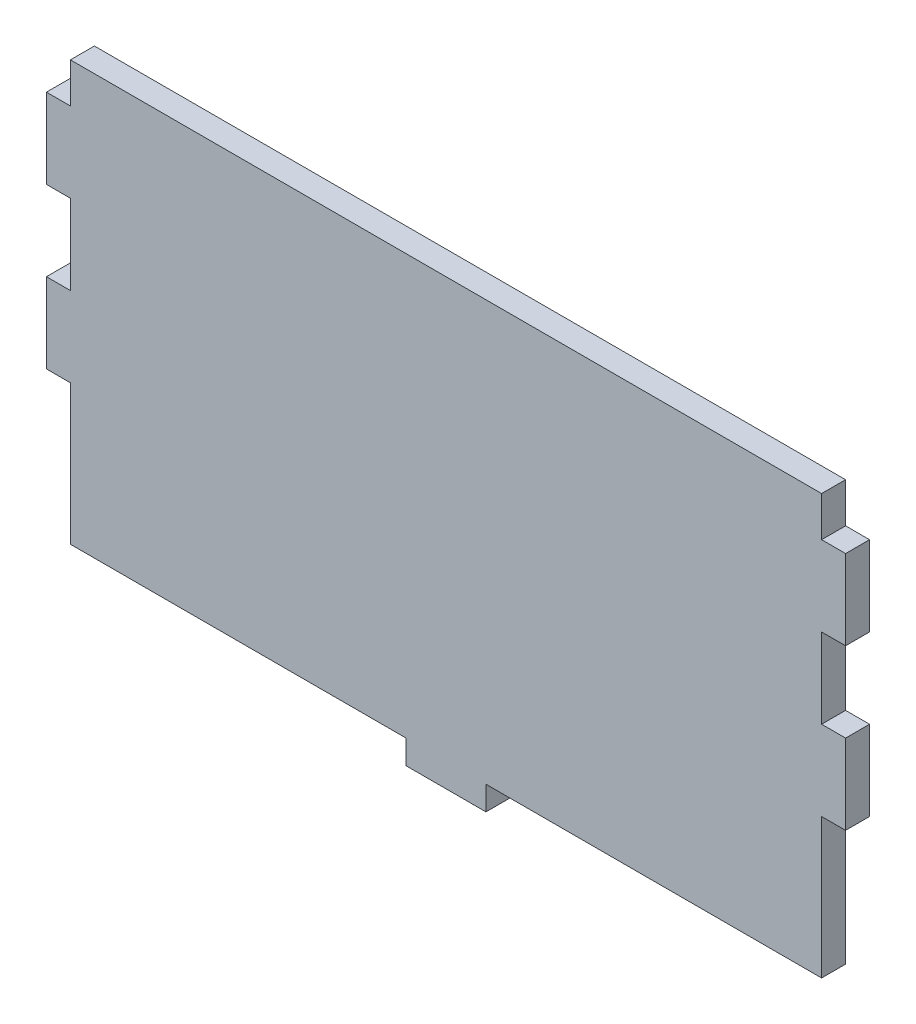
ISO-10303-21;
HEADER;
FILE_DESCRIPTION(('STEP AP214'),'2;1');
FILE_NAME('part.step','',(''),(''),'','','');
FILE_SCHEMA(('AUTOMOTIVE_DESIGN { 1 0 10303 214 1 1 1 1 }'));
ENDSEC;
DATA;
#1=APPLICATION_CONTEXT('core data for automotive mechanical design processes');
#2=APPLICATION_PROTOCOL_DEFINITION('international standard','automotive_design',2000,#1);
#3=PRODUCT_CONTEXT('',#1,'mechanical');
#4=PRODUCT('Part','Part','',(#3));
#5=PRODUCT_RELATED_PRODUCT_CATEGORY('part','',(#4));
#6=PRODUCT_DEFINITION_FORMATION('','',#4);
#7=PRODUCT_DEFINITION_CONTEXT('part definition',#1,'design');
#8=PRODUCT_DEFINITION('design','',#6,#7);
#9=PRODUCT_DEFINITION_SHAPE('','',#8);
#10=(LENGTH_UNIT() NAMED_UNIT(*) SI_UNIT(.MILLI.,.METRE.));
#11=(NAMED_UNIT(*) PLANE_ANGLE_UNIT() SI_UNIT($,.RADIAN.));
#12=(NAMED_UNIT(*) SI_UNIT($,.STERADIAN.) SOLID_ANGLE_UNIT());
#13=UNCERTAINTY_MEASURE_WITH_UNIT(LENGTH_MEASURE(1.E-05),#10,'distance_accuracy_value','');
#14=(GEOMETRIC_REPRESENTATION_CONTEXT(3) GLOBAL_UNCERTAINTY_ASSIGNED_CONTEXT((#13)) GLOBAL_UNIT_ASSIGNED_CONTEXT((#10,
#11,#12)) REPRESENTATION_CONTEXT('',''));
#15=CARTESIAN_POINT('',(0.,0.,0.));
#16=DIRECTION('',(0.,0.,1.));
#17=DIRECTION('',(1.,0.,0.));
#18=AXIS2_PLACEMENT_3D('',#15,#16,#17);
#19=CARTESIAN_POINT('',(-47.,0.,3.));
#20=DIRECTION('',(1.,0.,0.));
#21=DIRECTION('',(0.,1.,0.));
#22=AXIS2_PLACEMENT_3D('',#19,#20,#21);
#23=PLANE('',#22);
#24=DIRECTION('',(0.,0.,-1.));
#25=VECTOR('',#24,1.);
#26=CARTESIAN_POINT('',(-47.,20.2658369438358,3.));
#27=LINE('',#26,#25);
#28=CARTESIAN_POINT('',(-47.,20.2658369438358,3.));
#29=VERTEX_POINT('',#28);
#30=CARTESIAN_POINT('',(-47.,20.2658369438358,0.));
#31=VERTEX_POINT('',#30);
#32=EDGE_CURVE('E498',#29,#31,#27,.T.);
#33=ORIENTED_EDGE('',*,*,#32,.F.);
#34=DIRECTION('',(0.,-1.,0.));
#35=VECTOR('',#34,1.);
#36=CARTESIAN_POINT('',(-47.,0.,3.));
#37=LINE('',#36,#35);
#38=CARTESIAN_POINT('',(-47.,25.2658369438358,3.));
#39=VERTEX_POINT('',#38);
#40=EDGE_CURVE('E467',#39,#29,#37,.T.);
#41=ORIENTED_EDGE('',*,*,#40,.F.);
#42=DIRECTION('',(0.,0.,-1.));
#43=VECTOR('',#42,1.);
#44=CARTESIAN_POINT('',(-47.,25.2658369438358,3.));
#45=LINE('',#44,#43);
#46=CARTESIAN_POINT('',(-47.,25.2658369438358,0.));
#47=VERTEX_POINT('',#46);
#48=EDGE_CURVE('E466',#39,#47,#45,.T.);
#49=ORIENTED_EDGE('',*,*,#48,.T.);
#50=DIRECTION('',(0.,-1.,0.));
#51=VECTOR('',#50,1.);
#52=CARTESIAN_POINT('',(-47.,0.,0.));
#53=LINE('',#52,#51);
#54=EDGE_CURVE('E459',#47,#31,#53,.T.);
#55=ORIENTED_EDGE('',*,*,#54,.T.);
#56=EDGE_LOOP('',(#33,#41,#49,#55));
#57=FACE_BOUND('',#56,.T.);
#58=ADVANCED_FACE('F299',(#57),#23,.F.);
#59=CARTESIAN_POINT('',(-47.,10.2658369438358,3.));
#60=VERTEX_POINT('',#59);
#61=CARTESIAN_POINT('',(-47.,0.265836943835788,3.));
#62=VERTEX_POINT('',#61);
#63=EDGE_CURVE('E556',#60,#62,#37,.T.);
#64=ORIENTED_EDGE('',*,*,#63,.F.);
#65=DIRECTION('',(0.,0.,-1.));
#66=VECTOR('',#65,1.);
#67=CARTESIAN_POINT('',(-47.,10.2658369438358,3.));
#68=LINE('',#67,#66);
#69=CARTESIAN_POINT('',(-47.,10.2658369438358,0.));
#70=VERTEX_POINT('',#69);
#71=EDGE_CURVE('E318',#60,#70,#68,.T.);
#72=ORIENTED_EDGE('',*,*,#71,.T.);
#73=CARTESIAN_POINT('',(-47.,0.265836943835788,0.));
#74=VERTEX_POINT('',#73);
#75=EDGE_CURVE('E454',#70,#74,#53,.T.);
#76=ORIENTED_EDGE('',*,*,#75,.T.);
#77=DIRECTION('',(0.,0.,-1.));
#78=VECTOR('',#77,1.);
#79=CARTESIAN_POINT('',(-47.,0.265836943835788,3.));
#80=LINE('',#79,#78);
#81=EDGE_CURVE('E463',#62,#74,#80,.T.);
#82=ORIENTED_EDGE('',*,*,#81,.F.);
#83=EDGE_LOOP('',(#64,#72,#76,#82));
#84=FACE_BOUND('',#83,.T.);
#85=ADVANCED_FACE('F658',(#84),#23,.F.);
#86=CARTESIAN_POINT('',(-47.,-9.73416305616422,0.));
#87=VERTEX_POINT('',#86);
#88=CARTESIAN_POINT('',(-47.,-27.2341630561642,0.));
#89=VERTEX_POINT('',#88);
#90=EDGE_CURVE('E461',#87,#89,#53,.T.);
#91=ORIENTED_EDGE('',*,*,#90,.T.);
#92=DIRECTION('',(0.,0.,-1.));
#93=VECTOR('',#92,1.);
#94=CARTESIAN_POINT('',(-47.,-27.2341630561642,3.));
#95=LINE('',#94,#93);
#96=CARTESIAN_POINT('',(-47.,-27.2341630561642,3.));
#97=VERTEX_POINT('',#96);
#98=EDGE_CURVE('E486',#97,#89,#95,.T.);
#99=ORIENTED_EDGE('',*,*,#98,.F.);
#100=CARTESIAN_POINT('',(-47.,-9.73416305616422,3.));
#101=VERTEX_POINT('',#100);
#102=EDGE_CURVE('E573',#101,#97,#37,.T.);
#103=ORIENTED_EDGE('',*,*,#102,.F.);
#104=DIRECTION('',(0.,0.,-1.));
#105=VECTOR('',#104,1.);
#106=CARTESIAN_POINT('',(-47.,-9.73416305616422,3.));
#107=LINE('',#106,#105);
#108=EDGE_CURVE('E489',#101,#87,#107,.T.);
#109=ORIENTED_EDGE('',*,*,#108,.T.);
#110=EDGE_LOOP('',(#91,#99,#103,#109));
#111=FACE_BOUND('',#110,.T.);
#112=ADVANCED_FACE('F660',(#111),#23,.F.);
#113=CARTESIAN_POINT('',(0.,-27.2341630561642,3.));
#114=DIRECTION('',(0.,1.,0.));
#115=DIRECTION('',(0.,0.,1.));
#116=AXIS2_PLACEMENT_3D('',#113,#114,#115);
#117=PLANE('',#116);
#118=DIRECTION('',(1.,0.,0.));
#119=VECTOR('',#118,1.);
#120=CARTESIAN_POINT('',(0.,-27.2341630561642,0.));
#121=LINE('',#120,#119);
#122=CARTESIAN_POINT('',(5.00000000000001,-27.2341630561642,0.));
#123=VERTEX_POINT('',#122);
#124=CARTESIAN_POINT('',(47.,-27.2341630561642,0.));
#125=VERTEX_POINT('',#124);
#126=EDGE_CURVE('E442',#123,#125,#121,.T.);
#127=ORIENTED_EDGE('',*,*,#126,.T.);
#128=DIRECTION('',(0.,0.,-1.));
#129=VECTOR('',#128,1.);
#130=CARTESIAN_POINT('',(47.,-27.2341630561642,3.));
#131=LINE('',#130,#129);
#132=CARTESIAN_POINT('',(47.,-27.2341630561642,3.));
#133=VERTEX_POINT('',#132);
#134=EDGE_CURVE('E440',#133,#125,#131,.T.);
#135=ORIENTED_EDGE('',*,*,#134,.F.);
#136=DIRECTION('',(1.,0.,0.));
#137=VECTOR('',#136,1.);
#138=CARTESIAN_POINT('',(0.,-27.2341630561642,3.));
#139=LINE('',#138,#137);
#140=CARTESIAN_POINT('',(5.00000000000001,-27.2341630561642,3.));
#141=VERTEX_POINT('',#140);
#142=EDGE_CURVE('E559',#141,#133,#139,.T.);
#143=ORIENTED_EDGE('',*,*,#142,.F.);
#144=DIRECTION('',(0.,0.,-1.));
#145=VECTOR('',#144,1.);
#146=CARTESIAN_POINT('',(5.00000000000001,-27.2341630561642,3.));
#147=LINE('',#146,#145);
#148=EDGE_CURVE('E474',#141,#123,#147,.T.);
#149=ORIENTED_EDGE('',*,*,#148,.T.);
#150=EDGE_LOOP('',(#127,#135,#143,#149));
#151=FACE_BOUND('',#150,.T.);
#152=ADVANCED_FACE('F668',(#151),#117,.F.);
#153=CARTESIAN_POINT('',(-4.99999999999999,-27.2341630561642,0.));
#154=VERTEX_POINT('',#153);
#155=EDGE_CURVE('E447',#89,#154,#121,.T.);
#156=ORIENTED_EDGE('',*,*,#155,.T.);
#157=DIRECTION('',(0.,0.,-1.));
#158=VECTOR('',#157,1.);
#159=CARTESIAN_POINT('',(-4.99999999999999,-27.2341630561642,3.));
#160=LINE('',#159,#158);
#161=CARTESIAN_POINT('',(-4.99999999999999,-27.2341630561642,3.));
#162=VERTEX_POINT('',#161);
#163=EDGE_CURVE('E483',#162,#154,#160,.T.);
#164=ORIENTED_EDGE('',*,*,#163,.F.);
#165=EDGE_CURVE('E565',#97,#162,#139,.T.);
#166=ORIENTED_EDGE('',*,*,#165,.F.);
#167=ORIENTED_EDGE('',*,*,#98,.T.);
#168=EDGE_LOOP('',(#156,#164,#166,#167));
#169=FACE_BOUND('',#168,.T.);
#170=ADVANCED_FACE('F650',(#169),#117,.F.);
#171=CARTESIAN_POINT('',(47.,0.,3.));
#172=DIRECTION('',(1.,0.,0.));
#173=DIRECTION('',(0.,1.,0.));
#174=AXIS2_PLACEMENT_3D('',#171,#172,#173);
#175=PLANE('',#174);
#176=DIRECTION('',(0.,0.,-1.));
#177=VECTOR('',#176,1.);
#178=CARTESIAN_POINT('',(47.,-9.73416305616422,3.));
#179=LINE('',#178,#177);
#180=CARTESIAN_POINT('',(47.,-9.73416305616421,3.));
#181=VERTEX_POINT('',#180);
#182=CARTESIAN_POINT('',(47.,-9.73416305616421,0.));
#183=VERTEX_POINT('',#182);
#184=EDGE_CURVE('E303',#181,#183,#179,.T.);
#185=ORIENTED_EDGE('',*,*,#184,.F.);
#186=DIRECTION('',(0.,-1.,0.));
#187=VECTOR('',#186,1.);
#188=CARTESIAN_POINT('',(47.,0.,3.));
#189=LINE('',#188,#187);
#190=EDGE_CURVE('E555',#181,#133,#189,.T.);
#191=ORIENTED_EDGE('',*,*,#190,.T.);
#192=ORIENTED_EDGE('',*,*,#134,.T.);
#193=DIRECTION('',(0.,-1.,0.));
#194=VECTOR('',#193,1.);
#195=CARTESIAN_POINT('',(47.,0.,0.));
#196=LINE('',#195,#194);
#197=EDGE_CURVE('E432',#183,#125,#196,.T.);
#198=ORIENTED_EDGE('',*,*,#197,.F.);
#199=EDGE_LOOP('',(#185,#191,#192,#198));
#200=FACE_BOUND('',#199,.T.);
#201=ADVANCED_FACE('F437',(#200),#175,.T.);
#202=DIRECTION('',(0.,0.,-1.));
#203=VECTOR('',#202,1.);
#204=CARTESIAN_POINT('',(47.,10.2658369438358,3.));
#205=LINE('',#204,#203);
#206=CARTESIAN_POINT('',(47.,10.2658369438358,3.));
#207=VERTEX_POINT('',#206);
#208=CARTESIAN_POINT('',(47.,10.2658369438358,0.));
#209=VERTEX_POINT('',#208);
#210=EDGE_CURVE('E309',#207,#209,#205,.T.);
#211=ORIENTED_EDGE('',*,*,#210,.F.);
#212=CARTESIAN_POINT('',(47.,0.265836943835789,3.));
#213=VERTEX_POINT('',#212);
#214=EDGE_CURVE('E535',#207,#213,#189,.T.);
#215=ORIENTED_EDGE('',*,*,#214,.T.);
#216=DIRECTION('',(0.,0.,-1.));
#217=VECTOR('',#216,1.);
#218=CARTESIAN_POINT('',(47.,0.265836943835788,3.));
#219=LINE('',#218,#217);
#220=CARTESIAN_POINT('',(47.,0.265836943835789,0.));
#221=VERTEX_POINT('',#220);
#222=EDGE_CURVE('E396',#213,#221,#219,.T.);
#223=ORIENTED_EDGE('',*,*,#222,.T.);
#224=EDGE_CURVE('E389',#209,#221,#196,.T.);
#225=ORIENTED_EDGE('',*,*,#224,.F.);
#226=EDGE_LOOP('',(#211,#215,#223,#225));
#227=FACE_BOUND('',#226,.T.);
#228=ADVANCED_FACE('F642',(#227),#175,.T.);
#229=CARTESIAN_POINT('',(47.,25.2658369438358,3.));
#230=VERTEX_POINT('',#229);
#231=CARTESIAN_POINT('',(47.,20.2658369438358,3.));
#232=VERTEX_POINT('',#231);
#233=EDGE_CURVE('E547',#230,#232,#189,.T.);
#234=ORIENTED_EDGE('',*,*,#233,.T.);
#235=DIRECTION('',(0.,0.,-1.));
#236=VECTOR('',#235,1.);
#237=CARTESIAN_POINT('',(47.,20.2658369438358,3.));
#238=LINE('',#237,#236);
#239=CARTESIAN_POINT('',(47.,20.2658369438358,0.));
#240=VERTEX_POINT('',#239);
#241=EDGE_CURVE('E12',#232,#240,#238,.T.);
#242=ORIENTED_EDGE('',*,*,#241,.T.);
#243=CARTESIAN_POINT('',(47.,25.2658369438358,0.));
#244=VERTEX_POINT('',#243);
#245=EDGE_CURVE('E444',#244,#240,#196,.T.);
#246=ORIENTED_EDGE('',*,*,#245,.F.);
#247=DIRECTION('',(0.,0.,-1.));
#248=VECTOR('',#247,1.);
#249=CARTESIAN_POINT('',(47.,25.2658369438358,3.));
#250=LINE('',#249,#248);
#251=EDGE_CURVE('E470',#230,#244,#250,.T.);
#252=ORIENTED_EDGE('',*,*,#251,.F.);
#253=EDGE_LOOP('',(#234,#242,#246,#252));
#254=FACE_BOUND('',#253,.T.);
#255=ADVANCED_FACE('F552',(#254),#175,.T.);
#256=CARTESIAN_POINT('',(0.,25.2658369438358,3.));
#257=DIRECTION('',(0.,1.,0.));
#258=DIRECTION('',(0.,0.,1.));
#259=AXIS2_PLACEMENT_3D('',#256,#257,#258);
#260=PLANE('',#259);
#261=DIRECTION('',(1.,0.,0.));
#262=VECTOR('',#261,1.);
#263=CARTESIAN_POINT('',(0.,25.2658369438358,0.));
#264=LINE('',#263,#262);
#265=EDGE_CURVE('E450',#47,#244,#264,.T.);
#266=ORIENTED_EDGE('',*,*,#265,.F.);
#267=ORIENTED_EDGE('',*,*,#48,.F.);
#268=DIRECTION('',(1.,0.,0.));
#269=VECTOR('',#268,1.);
#270=CARTESIAN_POINT('',(0.,25.2658369438358,3.));
#271=LINE('',#270,#269);
#272=EDGE_CURVE('E553',#39,#230,#271,.T.);
#273=ORIENTED_EDGE('',*,*,#272,.T.);
#274=ORIENTED_EDGE('',*,*,#251,.T.);
#275=EDGE_LOOP('',(#266,#267,#273,#274));
#276=FACE_BOUND('',#275,.T.);
#277=ADVANCED_FACE('F649',(#276),#260,.T.);
#278=CARTESIAN_POINT('',(0.,0.265836943835802,3.));
#279=DIRECTION('',(0.,-1.,0.));
#280=DIRECTION('',(1.,0.,0.));
#281=AXIS2_PLACEMENT_3D('',#278,#279,#280);
#282=PLANE('',#281);
#283=DIRECTION('',(-1.,0.,0.));
#284=VECTOR('',#283,1.);
#285=CARTESIAN_POINT('',(0.,0.265836943835802,0.));
#286=LINE('',#285,#284);
#287=CARTESIAN_POINT('',(-50.,0.265836943835787,0.));
#288=VERTEX_POINT('',#287);
#289=EDGE_CURVE('E520',#74,#288,#286,.T.);
#290=ORIENTED_EDGE('',*,*,#289,.T.);
#291=DIRECTION('',(0.,0.,-1.));
#292=VECTOR('',#291,1.);
#293=CARTESIAN_POINT('',(-50.,0.265836943835787,3.));
#294=LINE('',#293,#292);
#295=CARTESIAN_POINT('',(-50.,0.265836943835787,3.));
#296=VERTEX_POINT('',#295);
#297=EDGE_CURVE('E495',#296,#288,#294,.T.);
#298=ORIENTED_EDGE('',*,*,#297,.F.);
#299=DIRECTION('',(-1.,0.,0.));
#300=VECTOR('',#299,1.);
#301=CARTESIAN_POINT('',(0.,0.265836943835802,3.));
#302=LINE('',#301,#300);
#303=EDGE_CURVE('E763',#62,#296,#302,.T.);
#304=ORIENTED_EDGE('',*,*,#303,.F.);
#305=ORIENTED_EDGE('',*,*,#81,.T.);
#306=EDGE_LOOP('',(#290,#298,#304,#305));
#307=FACE_BOUND('',#306,.T.);
#308=ADVANCED_FACE('F665',(#307),#282,.F.);
#309=CARTESIAN_POINT('',(-50.,-1.38777878078145E-13,3.));
#310=DIRECTION('',(1.,0.,0.));
#311=DIRECTION('',(0.,1.,0.));
#312=AXIS2_PLACEMENT_3D('',#309,#310,#311);
#313=PLANE('',#312);
#314=DIRECTION('',(0.,-1.,0.));
#315=VECTOR('',#314,1.);
#316=CARTESIAN_POINT('',(-50.,-1.38777878078145E-13,0.));
#317=LINE('',#316,#315);
#318=CARTESIAN_POINT('',(-50.,-9.73416305616421,0.));
#319=VERTEX_POINT('',#318);
#320=EDGE_CURVE('E748',#288,#319,#317,.T.);
#321=ORIENTED_EDGE('',*,*,#320,.T.);
#322=DIRECTION('',(0.,0.,-1.));
#323=VECTOR('',#322,1.);
#324=CARTESIAN_POINT('',(-50.,-9.73416305616421,3.));
#325=LINE('',#324,#323);
#326=CARTESIAN_POINT('',(-50.,-9.73416305616421,3.));
#327=VERTEX_POINT('',#326);
#328=EDGE_CURVE('E492',#327,#319,#325,.T.);
#329=ORIENTED_EDGE('',*,*,#328,.F.);
#330=DIRECTION('',(0.,-1.,0.));
#331=VECTOR('',#330,1.);
#332=CARTESIAN_POINT('',(-50.,-1.38777878078145E-13,3.));
#333=LINE('',#332,#331);
#334=EDGE_CURVE('E585',#296,#327,#333,.T.);
#335=ORIENTED_EDGE('',*,*,#334,.F.);
#336=ORIENTED_EDGE('',*,*,#297,.T.);
#337=EDGE_LOOP('',(#321,#329,#335,#336));
#338=FACE_BOUND('',#337,.T.);
#339=ADVANCED_FACE('F683',(#338),#313,.F.);
#340=CARTESIAN_POINT('',(0.,-9.73416305616424,3.));
#341=DIRECTION('',(0.,-1.,0.));
#342=DIRECTION('',(1.,0.,0.));
#343=AXIS2_PLACEMENT_3D('',#340,#341,#342);
#344=PLANE('',#343);
#345=DIRECTION('',(-1.,0.,0.));
#346=VECTOR('',#345,1.);
#347=CARTESIAN_POINT('',(0.,-9.73416305616424,0.));
#348=LINE('',#347,#346);
#349=EDGE_CURVE('E745',#87,#319,#348,.T.);
#350=ORIENTED_EDGE('',*,*,#349,.F.);
#351=ORIENTED_EDGE('',*,*,#108,.F.);
#352=DIRECTION('',(-1.,0.,0.));
#353=VECTOR('',#352,1.);
#354=CARTESIAN_POINT('',(0.,-9.73416305616424,3.));
#355=LINE('',#354,#353);
#356=EDGE_CURVE('E579',#101,#327,#355,.T.);
#357=ORIENTED_EDGE('',*,*,#356,.T.);
#358=ORIENTED_EDGE('',*,*,#328,.T.);
#359=EDGE_LOOP('',(#350,#351,#357,#358));
#360=FACE_BOUND('',#359,.T.);
#361=ADVANCED_FACE('F671',(#360),#344,.T.);
#362=CARTESIAN_POINT('',(-47.,20.2658369438358,3.));
#363=DIRECTION('',(0.,-1.,0.));
#364=DIRECTION('',(0.,0.,-1.));
#365=AXIS2_PLACEMENT_3D('',#362,#363,#364);
#366=PLANE('',#365);
#367=DIRECTION('',(-1.,0.,0.));
#368=VECTOR('',#367,1.);
#369=CARTESIAN_POINT('',(-47.,20.2658369438358,0.));
#370=LINE('',#369,#368);
#371=CARTESIAN_POINT('',(-50.,20.2658369438358,0.));
#372=VERTEX_POINT('',#371);
#373=EDGE_CURVE('E502',#31,#372,#370,.T.);
#374=ORIENTED_EDGE('',*,*,#373,.T.);
#375=DIRECTION('',(0.,0.,-1.));
#376=VECTOR('',#375,1.);
#377=CARTESIAN_POINT('',(-50.,20.2658369438358,3.));
#378=LINE('',#377,#376);
#379=CARTESIAN_POINT('',(-50.,20.2658369438358,3.));
#380=VERTEX_POINT('',#379);
#381=EDGE_CURVE('E518',#380,#372,#378,.T.);
#382=ORIENTED_EDGE('',*,*,#381,.F.);
#383=DIRECTION('',(-1.,0.,0.));
#384=VECTOR('',#383,1.);
#385=CARTESIAN_POINT('',(-47.,20.2658369438358,3.));
#386=LINE('',#385,#384);
#387=EDGE_CURVE('E505',#29,#380,#386,.T.);
#388=ORIENTED_EDGE('',*,*,#387,.F.);
#389=ORIENTED_EDGE('',*,*,#32,.T.);
#390=EDGE_LOOP('',(#374,#382,#388,#389));
#391=FACE_BOUND('',#390,.T.);
#392=ADVANCED_FACE('F670',(#391),#366,.F.);
#393=CARTESIAN_POINT('',(-50.,10.2658369438358,3.));
#394=DIRECTION('',(-1.,0.,0.));
#395=DIRECTION('',(0.,-1.,0.));
#396=AXIS2_PLACEMENT_3D('',#393,#394,#395);
#397=PLANE('',#396);
#398=DIRECTION('',(0.,1.,0.));
#399=VECTOR('',#398,1.);
#400=CARTESIAN_POINT('',(-50.,10.2658369438358,0.));
#401=LINE('',#400,#399);
#402=CARTESIAN_POINT('',(-50.,10.2658369438358,0.));
#403=VERTEX_POINT('',#402);
#404=EDGE_CURVE('E510',#403,#372,#401,.T.);
#405=ORIENTED_EDGE('',*,*,#404,.F.);
#406=DIRECTION('',(0.,0.,-1.));
#407=VECTOR('',#406,1.);
#408=CARTESIAN_POINT('',(-50.,10.2658369438358,3.));
#409=LINE('',#408,#407);
#410=CARTESIAN_POINT('',(-50.,10.2658369438358,3.));
#411=VERTEX_POINT('',#410);
#412=EDGE_CURVE('E507',#411,#403,#409,.T.);
#413=ORIENTED_EDGE('',*,*,#412,.F.);
#414=DIRECTION('',(0.,1.,0.));
#415=VECTOR('',#414,1.);
#416=CARTESIAN_POINT('',(-50.,10.2658369438358,3.));
#417=LINE('',#416,#415);
#418=EDGE_CURVE('E501',#411,#380,#417,.T.);
#419=ORIENTED_EDGE('',*,*,#418,.T.);
#420=ORIENTED_EDGE('',*,*,#381,.T.);
#421=EDGE_LOOP('',(#405,#413,#419,#420));
#422=FACE_BOUND('',#421,.T.);
#423=ADVANCED_FACE('F679',(#422),#397,.T.);
#424=CARTESIAN_POINT('',(-47.,10.2658369438358,3.));
#425=DIRECTION('',(0.,-1.,0.));
#426=DIRECTION('',(0.,0.,-1.));
#427=AXIS2_PLACEMENT_3D('',#424,#425,#426);
#428=PLANE('',#427);
#429=DIRECTION('',(-1.,0.,0.));
#430=VECTOR('',#429,1.);
#431=CARTESIAN_POINT('',(-47.,10.2658369438358,0.));
#432=LINE('',#431,#430);
#433=EDGE_CURVE('E419',#70,#403,#432,.T.);
#434=ORIENTED_EDGE('',*,*,#433,.F.);
#435=ORIENTED_EDGE('',*,*,#71,.F.);
#436=DIRECTION('',(-1.,0.,0.));
#437=VECTOR('',#436,1.);
#438=CARTESIAN_POINT('',(-47.,10.2658369438358,3.));
#439=LINE('',#438,#437);
#440=EDGE_CURVE('E499',#60,#411,#439,.T.);
#441=ORIENTED_EDGE('',*,*,#440,.T.);
#442=ORIENTED_EDGE('',*,*,#412,.T.);
#443=EDGE_LOOP('',(#434,#435,#441,#442));
#444=FACE_BOUND('',#443,.T.);
#445=ADVANCED_FACE('F677',(#444),#428,.T.);
#446=CARTESIAN_POINT('',(0.,-30.2341630561642,3.));
#447=DIRECTION('',(0.,1.,0.));
#448=DIRECTION('',(0.,0.,1.));
#449=AXIS2_PLACEMENT_3D('',#446,#447,#448);
#450=PLANE('',#449);
#451=DIRECTION('',(1.,0.,0.));
#452=VECTOR('',#451,1.);
#453=CARTESIAN_POINT('',(0.,-30.2341630561642,0.));
#454=LINE('',#453,#452);
#455=CARTESIAN_POINT('',(-5.,-30.2341630561642,0.));
#456=VERTEX_POINT('',#455);
#457=CARTESIAN_POINT('',(5.,-30.2341630561642,0.));
#458=VERTEX_POINT('',#457);
#459=EDGE_CURVE('E734',#456,#458,#454,.T.);
#460=ORIENTED_EDGE('',*,*,#459,.T.);
#461=DIRECTION('',(0.,0.,-1.));
#462=VECTOR('',#461,1.);
#463=CARTESIAN_POINT('',(5.,-30.2341630561642,3.));
#464=LINE('',#463,#462);
#465=CARTESIAN_POINT('',(5.,-30.2341630561642,3.));
#466=VERTEX_POINT('',#465);
#467=EDGE_CURVE('E477',#466,#458,#464,.T.);
#468=ORIENTED_EDGE('',*,*,#467,.F.);
#469=DIRECTION('',(1.,0.,0.));
#470=VECTOR('',#469,1.);
#471=CARTESIAN_POINT('',(0.,-30.2341630561642,3.));
#472=LINE('',#471,#470);
#473=CARTESIAN_POINT('',(-5.,-30.2341630561642,3.));
#474=VERTEX_POINT('',#473);
#475=EDGE_CURVE('E568',#474,#466,#472,.T.);
#476=ORIENTED_EDGE('',*,*,#475,.F.);
#477=DIRECTION('',(0.,0.,-1.));
#478=VECTOR('',#477,1.);
#479=CARTESIAN_POINT('',(-5.,-30.2341630561642,3.));
#480=LINE('',#479,#478);
#481=EDGE_CURVE('E480',#474,#456,#480,.T.);
#482=ORIENTED_EDGE('',*,*,#481,.T.);
#483=EDGE_LOOP('',(#460,#468,#476,#482));
#484=FACE_BOUND('',#483,.T.);
#485=ADVANCED_FACE('F676',(#484),#450,.F.);
#486=CARTESIAN_POINT('',(5.00000000000006,0.,3.));
#487=DIRECTION('',(1.,0.,0.));
#488=DIRECTION('',(0.,1.,0.));
#489=AXIS2_PLACEMENT_3D('',#486,#487,#488);
#490=PLANE('',#489);
#491=DIRECTION('',(0.,-1.,0.));
#492=VECTOR('',#491,1.);
#493=CARTESIAN_POINT('',(5.00000000000006,0.,0.));
#494=LINE('',#493,#492);
#495=EDGE_CURVE('E445',#123,#458,#494,.T.);
#496=ORIENTED_EDGE('',*,*,#495,.F.);
#497=ORIENTED_EDGE('',*,*,#148,.F.);
#498=DIRECTION('',(0.,-1.,0.));
#499=VECTOR('',#498,1.);
#500=CARTESIAN_POINT('',(5.00000000000006,0.,3.));
#501=LINE('',#500,#499);
#502=EDGE_CURVE('E563',#141,#466,#501,.T.);
#503=ORIENTED_EDGE('',*,*,#502,.T.);
#504=ORIENTED_EDGE('',*,*,#467,.T.);
#505=EDGE_LOOP('',(#496,#497,#503,#504));
#506=FACE_BOUND('',#505,.T.);
#507=ADVANCED_FACE('F724',(#506),#490,.T.);
#508=CARTESIAN_POINT('',(-4.99999999999999,0.,3.));
#509=DIRECTION('',(1.,0.,0.));
#510=DIRECTION('',(0.,1.,0.));
#511=AXIS2_PLACEMENT_3D('',#508,#509,#510);
#512=PLANE('',#511);
#513=DIRECTION('',(0.,-1.,0.));
#514=VECTOR('',#513,1.);
#515=CARTESIAN_POINT('',(-4.99999999999999,0.,0.));
#516=LINE('',#515,#514);
#517=EDGE_CURVE('E739',#154,#456,#516,.T.);
#518=ORIENTED_EDGE('',*,*,#517,.T.);
#519=ORIENTED_EDGE('',*,*,#481,.F.);
#520=DIRECTION('',(0.,-1.,0.));
#521=VECTOR('',#520,1.);
#522=CARTESIAN_POINT('',(-4.99999999999999,0.,3.));
#523=LINE('',#522,#521);
#524=EDGE_CURVE('E572',#162,#474,#523,.T.);
#525=ORIENTED_EDGE('',*,*,#524,.F.);
#526=ORIENTED_EDGE('',*,*,#163,.T.);
#527=EDGE_LOOP('',(#518,#519,#525,#526));
#528=FACE_BOUND('',#527,.T.);
#529=ADVANCED_FACE('F693',(#528),#512,.F.);
#530=CARTESIAN_POINT('',(0.,0.,0.));
#531=DIRECTION('',(0.,0.,1.));
#532=DIRECTION('',(1.,0.,0.));
#533=AXIS2_PLACEMENT_3D('',#530,#531,#532);
#534=PLANE('',#533);
#535=ORIENTED_EDGE('',*,*,#517,.F.);
#536=ORIENTED_EDGE('',*,*,#155,.F.);
#537=ORIENTED_EDGE('',*,*,#90,.F.);
#538=ORIENTED_EDGE('',*,*,#349,.T.);
#539=ORIENTED_EDGE('',*,*,#320,.F.);
#540=ORIENTED_EDGE('',*,*,#289,.F.);
#541=ORIENTED_EDGE('',*,*,#75,.F.);
#542=ORIENTED_EDGE('',*,*,#433,.T.);
#543=ORIENTED_EDGE('',*,*,#404,.T.);
#544=ORIENTED_EDGE('',*,*,#373,.F.);
#545=ORIENTED_EDGE('',*,*,#54,.F.);
#546=ORIENTED_EDGE('',*,*,#265,.T.);
#547=ORIENTED_EDGE('',*,*,#245,.T.);
#548=DIRECTION('',(1.,0.,0.));
#549=VECTOR('',#548,1.);
#550=CARTESIAN_POINT('',(47.,20.2658369438358,0.));
#551=LINE('',#550,#549);
#552=CARTESIAN_POINT('',(50.,20.2658369438358,0.));
#553=VERTEX_POINT('',#552);
#554=EDGE_CURVE('E398',#240,#553,#551,.T.);
#555=ORIENTED_EDGE('',*,*,#554,.T.);
#556=DIRECTION('',(0.,1.,0.));
#557=VECTOR('',#556,1.);
#558=CARTESIAN_POINT('',(50.,10.2658369438358,0.));
#559=LINE('',#558,#557);
#560=CARTESIAN_POINT('',(50.,10.2658369438358,0.));
#561=VERTEX_POINT('',#560);
#562=EDGE_CURVE('E400',#561,#553,#559,.T.);
#563=ORIENTED_EDGE('',*,*,#562,.F.);
#564=DIRECTION('',(1.,0.,0.));
#565=VECTOR('',#564,1.);
#566=CARTESIAN_POINT('',(47.,10.2658369438358,0.));
#567=LINE('',#566,#565);
#568=EDGE_CURVE('E406',#209,#561,#567,.T.);
#569=ORIENTED_EDGE('',*,*,#568,.F.);
#570=ORIENTED_EDGE('',*,*,#224,.T.);
#571=DIRECTION('',(1.,0.,0.));
#572=VECTOR('',#571,1.);
#573=CARTESIAN_POINT('',(47.,0.265836943835788,0.));
#574=LINE('',#573,#572);
#575=CARTESIAN_POINT('',(50.,0.265836943835787,0.));
#576=VERTEX_POINT('',#575);
#577=EDGE_CURVE('E372',#221,#576,#574,.T.);
#578=ORIENTED_EDGE('',*,*,#577,.T.);
#579=DIRECTION('',(0.,-1.,0.));
#580=VECTOR('',#579,1.);
#581=CARTESIAN_POINT('',(50.,0.265836943835787,0.));
#582=LINE('',#581,#580);
#583=CARTESIAN_POINT('',(50.,-9.73416305616421,0.));
#584=VERTEX_POINT('',#583);
#585=EDGE_CURVE('E379',#576,#584,#582,.T.);
#586=ORIENTED_EDGE('',*,*,#585,.T.);
#587=DIRECTION('',(1.,0.,0.));
#588=VECTOR('',#587,1.);
#589=CARTESIAN_POINT('',(47.,-9.73416305616422,0.));
#590=LINE('',#589,#588);
#591=EDGE_CURVE('E383',#183,#584,#590,.T.);
#592=ORIENTED_EDGE('',*,*,#591,.F.);
#593=ORIENTED_EDGE('',*,*,#197,.T.);
#594=ORIENTED_EDGE('',*,*,#126,.F.);
#595=ORIENTED_EDGE('',*,*,#495,.T.);
#596=ORIENTED_EDGE('',*,*,#459,.F.);
#597=EDGE_LOOP('',(#535,#536,#537,#538,#539,#540,#541,#542,#543,#544,#545,#546,#547,#555,#563,
#569,#570,#578,#586,#592,#593,#594,#595,#596));
#598=FACE_BOUND('',#597,.T.);
#599=ADVANCED_FACE('F386',(#598),#534,.F.);
#600=CARTESIAN_POINT('',(0.,0.,3.));
#601=DIRECTION('',(0.,0.,1.));
#602=DIRECTION('',(1.,0.,0.));
#603=AXIS2_PLACEMENT_3D('',#600,#601,#602);
#604=PLANE('',#603);
#605=ORIENTED_EDGE('',*,*,#502,.F.);
#606=ORIENTED_EDGE('',*,*,#142,.T.);
#607=ORIENTED_EDGE('',*,*,#190,.F.);
#608=DIRECTION('',(1.,0.,0.));
#609=VECTOR('',#608,1.);
#610=CARTESIAN_POINT('',(47.,-9.73416305616422,3.));
#611=LINE('',#610,#609);
#612=CARTESIAN_POINT('',(50.,-9.73416305616421,3.));
#613=VERTEX_POINT('',#612);
#614=EDGE_CURVE('E390',#181,#613,#611,.T.);
#615=ORIENTED_EDGE('',*,*,#614,.T.);
#616=DIRECTION('',(0.,-1.,0.));
#617=VECTOR('',#616,1.);
#618=CARTESIAN_POINT('',(50.,0.265836943835787,3.));
#619=LINE('',#618,#617);
#620=CARTESIAN_POINT('',(50.,0.265836943835787,3.));
#621=VERTEX_POINT('',#620);
#622=EDGE_CURVE('E392',#621,#613,#619,.T.);
#623=ORIENTED_EDGE('',*,*,#622,.F.);
#624=DIRECTION('',(1.,0.,0.));
#625=VECTOR('',#624,1.);
#626=CARTESIAN_POINT('',(47.,0.265836943835788,3.));
#627=LINE('',#626,#625);
#628=EDGE_CURVE('E375',#213,#621,#627,.T.);
#629=ORIENTED_EDGE('',*,*,#628,.F.);
#630=ORIENTED_EDGE('',*,*,#214,.F.);
#631=DIRECTION('',(1.,0.,0.));
#632=VECTOR('',#631,1.);
#633=CARTESIAN_POINT('',(47.,10.2658369438358,3.));
#634=LINE('',#633,#632);
#635=CARTESIAN_POINT('',(50.,10.2658369438358,3.));
#636=VERTEX_POINT('',#635);
#637=EDGE_CURVE('E409',#207,#636,#634,.T.);
#638=ORIENTED_EDGE('',*,*,#637,.T.);
#639=DIRECTION('',(0.,1.,0.));
#640=VECTOR('',#639,1.);
#641=CARTESIAN_POINT('',(50.,10.2658369438358,3.));
#642=LINE('',#641,#640);
#643=CARTESIAN_POINT('',(50.,20.2658369438358,3.));
#644=VERTEX_POINT('',#643);
#645=EDGE_CURVE('E523',#636,#644,#642,.T.);
#646=ORIENTED_EDGE('',*,*,#645,.T.);
#647=DIRECTION('',(1.,0.,0.));
#648=VECTOR('',#647,1.);
#649=CARTESIAN_POINT('',(47.,20.2658369438358,3.));
#650=LINE('',#649,#648);
#651=EDGE_CURVE('E413',#232,#644,#650,.T.);
#652=ORIENTED_EDGE('',*,*,#651,.F.);
#653=ORIENTED_EDGE('',*,*,#233,.F.);
#654=ORIENTED_EDGE('',*,*,#272,.F.);
#655=ORIENTED_EDGE('',*,*,#40,.T.);
#656=ORIENTED_EDGE('',*,*,#387,.T.);
#657=ORIENTED_EDGE('',*,*,#418,.F.);
#658=ORIENTED_EDGE('',*,*,#440,.F.);
#659=ORIENTED_EDGE('',*,*,#63,.T.);
#660=ORIENTED_EDGE('',*,*,#303,.T.);
#661=ORIENTED_EDGE('',*,*,#334,.T.);
#662=ORIENTED_EDGE('',*,*,#356,.F.);
#663=ORIENTED_EDGE('',*,*,#102,.T.);
#664=ORIENTED_EDGE('',*,*,#165,.T.);
#665=ORIENTED_EDGE('',*,*,#524,.T.);
#666=ORIENTED_EDGE('',*,*,#475,.T.);
#667=EDGE_LOOP('',(#605,#606,#607,#615,#623,#629,#630,#638,#646,#652,#653,#654,#655,#656,#657,
#658,#659,#660,#661,#662,#663,#664,#665,#666));
#668=FACE_BOUND('',#667,.T.);
#669=ADVANCED_FACE('F532',(#668),#604,.T.);
#670=CARTESIAN_POINT('',(47.,-9.73416305616422,3.));
#671=DIRECTION('',(0.,1.,0.));
#672=DIRECTION('',(-1.,0.,0.));
#673=AXIS2_PLACEMENT_3D('',#670,#671,#672);
#674=PLANE('',#673);
#675=ORIENTED_EDGE('',*,*,#591,.T.);
#676=DIRECTION('',(0.,0.,-1.));
#677=VECTOR('',#676,1.);
#678=CARTESIAN_POINT('',(50.,-9.73416305616421,3.));
#679=LINE('',#678,#677);
#680=EDGE_CURVE('E361',#613,#584,#679,.T.);
#681=ORIENTED_EDGE('',*,*,#680,.F.);
#682=ORIENTED_EDGE('',*,*,#614,.F.);
#683=ORIENTED_EDGE('',*,*,#184,.T.);
#684=EDGE_LOOP('',(#675,#681,#682,#683));
#685=FACE_BOUND('',#684,.T.);
#686=ADVANCED_FACE('F301',(#685),#674,.F.);
#687=CARTESIAN_POINT('',(50.,0.265836943835787,3.));
#688=DIRECTION('',(1.,0.,0.));
#689=DIRECTION('',(0.,1.,0.));
#690=AXIS2_PLACEMENT_3D('',#687,#688,#689);
#691=PLANE('',#690);
#692=ORIENTED_EDGE('',*,*,#585,.F.);
#693=DIRECTION('',(0.,0.,-1.));
#694=VECTOR('',#693,1.);
#695=CARTESIAN_POINT('',(50.,0.265836943835787,3.));
#696=LINE('',#695,#694);
#697=EDGE_CURVE('E367',#621,#576,#696,.T.);
#698=ORIENTED_EDGE('',*,*,#697,.F.);
#699=ORIENTED_EDGE('',*,*,#622,.T.);
#700=ORIENTED_EDGE('',*,*,#680,.T.);
#701=EDGE_LOOP('',(#692,#698,#699,#700));
#702=FACE_BOUND('',#701,.T.);
#703=ADVANCED_FACE('F380',(#702),#691,.T.);
#704=CARTESIAN_POINT('',(47.,0.265836943835788,3.));
#705=DIRECTION('',(0.,1.,0.));
#706=DIRECTION('',(-1.,0.,0.));
#707=AXIS2_PLACEMENT_3D('',#704,#705,#706);
#708=PLANE('',#707);
#709=ORIENTED_EDGE('',*,*,#577,.F.);
#710=ORIENTED_EDGE('',*,*,#222,.F.);
#711=ORIENTED_EDGE('',*,*,#628,.T.);
#712=ORIENTED_EDGE('',*,*,#697,.T.);
#713=EDGE_LOOP('',(#709,#710,#711,#712));
#714=FACE_BOUND('',#713,.T.);
#715=ADVANCED_FACE('F368',(#714),#708,.T.);
#716=CARTESIAN_POINT('',(47.,10.2658369438358,3.));
#717=DIRECTION('',(0.,1.,0.));
#718=DIRECTION('',(0.,0.,1.));
#719=AXIS2_PLACEMENT_3D('',#716,#717,#718);
#720=PLANE('',#719);
#721=ORIENTED_EDGE('',*,*,#568,.T.);
#722=DIRECTION('',(0.,0.,-1.));
#723=VECTOR('',#722,1.);
#724=CARTESIAN_POINT('',(50.,10.2658369438358,3.));
#725=LINE('',#724,#723);
#726=EDGE_CURVE('E416',#636,#561,#725,.T.);
#727=ORIENTED_EDGE('',*,*,#726,.F.);
#728=ORIENTED_EDGE('',*,*,#637,.F.);
#729=ORIENTED_EDGE('',*,*,#210,.T.);
#730=EDGE_LOOP('',(#721,#727,#728,#729));
#731=FACE_BOUND('',#730,.T.);
#732=ADVANCED_FACE('F537',(#731),#720,.F.);
#733=CARTESIAN_POINT('',(50.,10.2658369438358,3.));
#734=DIRECTION('',(-1.,0.,0.));
#735=DIRECTION('',(0.,-1.,0.));
#736=AXIS2_PLACEMENT_3D('',#733,#734,#735);
#737=PLANE('',#736);
#738=ORIENTED_EDGE('',*,*,#562,.T.);
#739=DIRECTION('',(0.,0.,-1.));
#740=VECTOR('',#739,1.);
#741=CARTESIAN_POINT('',(50.,20.2658369438358,3.));
#742=LINE('',#741,#740);
#743=EDGE_CURVE('E420',#644,#553,#742,.T.);
#744=ORIENTED_EDGE('',*,*,#743,.F.);
#745=ORIENTED_EDGE('',*,*,#645,.F.);
#746=ORIENTED_EDGE('',*,*,#726,.T.);
#747=EDGE_LOOP('',(#738,#744,#745,#746));
#748=FACE_BOUND('',#747,.T.);
#749=ADVANCED_FACE('F539',(#748),#737,.F.);
#750=CARTESIAN_POINT('',(47.,20.2658369438358,3.));
#751=DIRECTION('',(0.,1.,0.));
#752=DIRECTION('',(0.,0.,1.));
#753=AXIS2_PLACEMENT_3D('',#750,#751,#752);
#754=PLANE('',#753);
#755=ORIENTED_EDGE('',*,*,#554,.F.);
#756=ORIENTED_EDGE('',*,*,#241,.F.);
#757=ORIENTED_EDGE('',*,*,#651,.T.);
#758=ORIENTED_EDGE('',*,*,#743,.T.);
#759=EDGE_LOOP('',(#755,#756,#757,#758));
#760=FACE_BOUND('',#759,.T.);
#761=ADVANCED_FACE('F542',(#760),#754,.T.);
#762=CLOSED_SHELL('',(#58,#85,#112,#152,#170,#201,#228,#255,#277,#308,#339,#361,#392,#423,#445,
#485,#507,#529,#599,#669,#686,#703,#715,#732,#749,#761));
#763=MANIFOLD_SOLID_BREP('B2',#762);
#764=ADVANCED_BREP_SHAPE_REPRESENTATION('',(#18,#763),#14);
#765=SHAPE_DEFINITION_REPRESENTATION(#9,#764);
ENDSEC;
END-ISO-10303-21;
